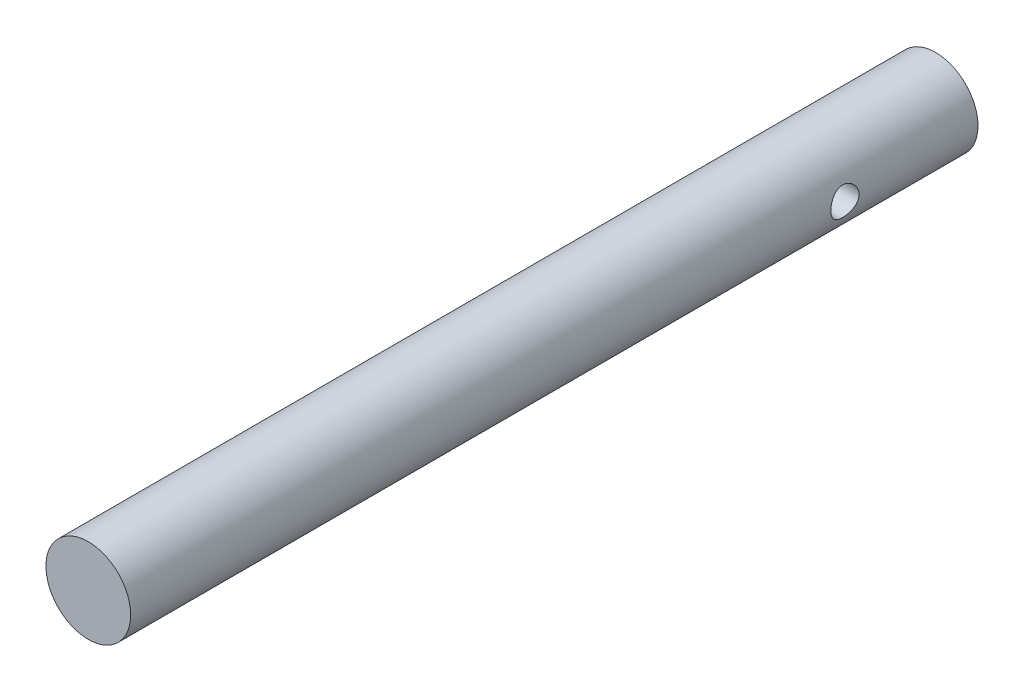
ISO-10303-21;
HEADER;
FILE_DESCRIPTION(('STEP AP214'),'2;1');
FILE_NAME('part.step','',(''),(''),'','','');
FILE_SCHEMA(('AUTOMOTIVE_DESIGN { 1 0 10303 214 1 1 1 1 }'));
ENDSEC;
DATA;
#1=APPLICATION_CONTEXT('core data for automotive mechanical design processes');
#2=APPLICATION_PROTOCOL_DEFINITION('international standard','automotive_design',2000,#1);
#3=PRODUCT_CONTEXT('',#1,'mechanical');
#4=PRODUCT('Part','Part','',(#3));
#5=PRODUCT_RELATED_PRODUCT_CATEGORY('part','',(#4));
#6=PRODUCT_DEFINITION_FORMATION('','',#4);
#7=PRODUCT_DEFINITION_CONTEXT('part definition',#1,'design');
#8=PRODUCT_DEFINITION('design','',#6,#7);
#9=PRODUCT_DEFINITION_SHAPE('','',#8);
#10=(LENGTH_UNIT() NAMED_UNIT(*) SI_UNIT(.MILLI.,.METRE.));
#11=(NAMED_UNIT(*) PLANE_ANGLE_UNIT() SI_UNIT($,.RADIAN.));
#12=(NAMED_UNIT(*) SI_UNIT($,.STERADIAN.) SOLID_ANGLE_UNIT());
#13=UNCERTAINTY_MEASURE_WITH_UNIT(LENGTH_MEASURE(1.E-05),#10,'distance_accuracy_value','');
#14=(GEOMETRIC_REPRESENTATION_CONTEXT(3) GLOBAL_UNCERTAINTY_ASSIGNED_CONTEXT((#13)) GLOBAL_UNIT_ASSIGNED_CONTEXT((#10,
#11,#12)) REPRESENTATION_CONTEXT('',''));
#15=CARTESIAN_POINT('',(0.,0.,0.));
#16=DIRECTION('',(0.,0.,1.));
#17=DIRECTION('',(1.,0.,0.));
#18=AXIS2_PLACEMENT_3D('',#15,#16,#17);
#19=CARTESIAN_POINT('',(0.,0.,60.));
#20=DIRECTION('',(0.,0.,-1.));
#21=DIRECTION('',(-1.,0.,0.));
#22=AXIS2_PLACEMENT_3D('',#19,#20,#21);
#23=CYLINDRICAL_SURFACE('',#22,3.);
#24=CARTESIAN_POINT('',(-3.,0.,8.42));
#25=CARTESIAN_POINT('',(-3.00000015300943,0.0545633628867235,8.41999974626836));
#26=CARTESIAN_POINT('',(-2.99849769507545,0.10912519453855,8.42448026612721));
#27=CARTESIAN_POINT('',(-2.99265210203281,0.216641760872973,8.44222910881722));
#28=CARTESIAN_POINT('',(-2.98830867202153,0.269596328118818,8.45549834394892));
#29=CARTESIAN_POINT('',(-2.97725307906443,0.372332789501776,8.49031924338405));
#30=CARTESIAN_POINT('',(-2.97054487730853,0.422119825886035,8.51185706245927));
#31=CARTESIAN_POINT('',(-2.95544445717342,0.517374936805325,8.56254117283834));
#32=CARTESIAN_POINT('',(-2.94705190667778,0.562842156958706,8.5916889650026));
#33=CARTESIAN_POINT('',(-2.92914094443005,0.649741675022267,8.65782580485875));
#34=CARTESIAN_POINT('',(-2.91959556463785,0.69100370029831,8.69503123426049));
#35=CARTESIAN_POINT('',(-2.90060314783122,0.766832692702085,8.77576715470656));
#36=CARTESIAN_POINT('',(-2.89115613290549,0.801398185489463,8.81929903492851));
#37=CARTESIAN_POINT('',(-2.87313332477274,0.86382494222786,8.91298511519646));
#38=CARTESIAN_POINT('',(-2.86459039275688,0.891464858221033,8.96329373973212));
#39=CARTESIAN_POINT('',(-2.84975305418601,0.937818873877723,9.06817609445855));
#40=CARTESIAN_POINT('',(-2.84345796160746,0.956535697386766,9.12274851716274));
#41=CARTESIAN_POINT('',(-2.83411303269377,0.983873461509165,9.23267322149671));
#42=CARTESIAN_POINT('',(-2.83096095769611,0.992813448271771,9.28793720848906));
#43=CARTESIAN_POINT('',(-2.82795656629508,1.00134112333448,9.39926375415588));
#44=CARTESIAN_POINT('',(-2.8281032302273,1.00093170160472,9.45532606070919));
#45=CARTESIAN_POINT('',(-2.8315901500818,0.99101990370342,9.56393663044402));
#46=CARTESIAN_POINT('',(-2.83478415867533,0.981933913166996,9.61652840291902));
#47=CARTESIAN_POINT('',(-2.84376657724551,0.955606162849418,9.71939341960683));
#48=CARTESIAN_POINT('',(-2.84955529784108,0.938363426591872,9.76966638543507));
#49=CARTESIAN_POINT('',(-2.86317911131249,0.895939058060212,9.86741274959148));
#50=CARTESIAN_POINT('',(-2.87104565793117,0.870634048707263,9.91482802546953));
#51=CARTESIAN_POINT('',(-2.88792558575726,0.81288910630314,10.0048709082797));
#52=CARTESIAN_POINT('',(-2.89693929790464,0.780447112364007,10.0474971269334));
#53=CARTESIAN_POINT('',(-2.91567329167741,0.707349332682239,10.1290915981608));
#54=CARTESIAN_POINT('',(-2.92540589354843,0.666353150076312,10.1677526945091));
#55=CARTESIAN_POINT('',(-2.94406938387037,0.578339569970065,10.2377312666634));
#56=CARTESIAN_POINT('',(-2.95300019538067,0.531321595660815,10.2690480381645));
#57=CARTESIAN_POINT('',(-2.96917107937794,0.431947613046268,10.3236963002351));
#58=CARTESIAN_POINT('',(-2.97639350008039,0.379543276416337,10.3469454913407));
#59=CARTESIAN_POINT('',(-2.98820567144435,0.271269083364508,10.3842031739557));
#60=CARTESIAN_POINT('',(-2.99279633654879,0.215400438154955,10.3982148754234));
#61=CARTESIAN_POINT('',(-2.99867627071441,0.104383829529304,10.4160556660224));
#62=CARTESIAN_POINT('',(-3.00010001833731,0.0493095998648456,10.4202998091727));
#63=CARTESIAN_POINT('',(-2.99988902694825,-0.0607750699602363,10.4196673264015));
#64=CARTESIAN_POINT('',(-2.99825480419352,-0.115785519319647,10.4147922400201));
#65=CARTESIAN_POINT('',(-2.99220024717114,-0.222519866304259,10.396388092264));
#66=CARTESIAN_POINT('',(-2.98786198711228,-0.274292806834856,10.3831137939505));
#67=CARTESIAN_POINT('',(-2.97691846830034,-0.374855958579561,10.3486065555333));
#68=CARTESIAN_POINT('',(-2.97031292046541,-0.42364578850856,10.3273726005323));
#69=CARTESIAN_POINT('',(-2.95528931287427,-0.518288296393322,10.2769295681591));
#70=CARTESIAN_POINT('',(-2.94682814756305,-0.56402995921733,10.2475254067164));
#71=CARTESIAN_POINT('',(-2.92905253915743,-0.650064830135404,10.1818058499869));
#72=CARTESIAN_POINT('',(-2.91973783591888,-0.690356367794894,10.1454883439698));
#73=CARTESIAN_POINT('',(-2.90076847982472,-0.766252507807014,10.0650212489917));
#74=CARTESIAN_POINT('',(-2.89111761095155,-0.801560969248492,10.0205907730668));
#75=CARTESIAN_POINT('',(-2.87299973286981,-0.864257522320854,9.9262284321955));
#76=CARTESIAN_POINT('',(-2.8645327335312,-0.891645547920844,9.8762965213898));
#77=CARTESIAN_POINT('',(-2.84982391820308,-0.937596930423361,9.77232698469341));
#78=CARTESIAN_POINT('',(-2.84357760900632,-0.956178132197767,9.71829792075722));
#79=CARTESIAN_POINT('',(-2.83410832399133,-0.983894666792164,9.60762134987585));
#80=CARTESIAN_POINT('',(-2.83088398622698,-0.993034254961245,9.55097503456694));
#81=CARTESIAN_POINT('',(-2.82797858875071,-1.00127628247038,9.43980290398679));
#82=CARTESIAN_POINT('',(-2.82812400344299,-1.00087025731093,9.38531765974826));
#83=CARTESIAN_POINT('',(-2.8315126992356,-0.99124229345488,9.27723492510026));
#84=CARTESIAN_POINT('',(-2.83475579595884,-0.982020879458888,9.22363738204709));
#85=CARTESIAN_POINT('',(-2.84384524278943,-0.955371813126982,9.11986433698733));
#86=CARTESIAN_POINT('',(-2.84964098015514,-0.938103346014881,9.06964317499277));
#87=CARTESIAN_POINT('',(-2.86316398825434,-0.895979365760384,8.97277259306447));
#88=CARTESIAN_POINT('',(-2.87089168765297,-0.871122168553981,8.92612396881274));
#89=CARTESIAN_POINT('',(-2.8878282922406,-0.813260692583251,8.83551633007631));
#90=CARTESIAN_POINT('',(-2.89708711641604,-0.779948242764534,8.7917634981014));
#91=CARTESIAN_POINT('',(-2.91583356283786,-0.706642883135699,8.71031018661601));
#92=CARTESIAN_POINT('',(-2.92532124912518,-0.666648084451496,8.67261142431198));
#93=CARTESIAN_POINT('',(-2.94390030525393,-0.579241556920676,8.60285558771076));
#94=CARTESIAN_POINT('',(-2.95296181801216,-0.531601513499727,8.57107565224898));
#95=CARTESIAN_POINT('',(-2.96925991172652,-0.43135735740663,8.51600957114937));
#96=CARTESIAN_POINT('',(-2.9764969590794,-0.378754518132351,8.49272125407796));
#97=CARTESIAN_POINT('',(-2.98805515068532,-0.272493647200976,8.45627836751132));
#98=CARTESIAN_POINT('',(-2.9924921242252,-0.218987757676409,8.44271753373662));
#99=CARTESIAN_POINT('',(-2.99846407064225,-0.110320416010248,8.42457971932287));
#100=CARTESIAN_POINT('',(-2.99999984531906,-0.0551594255687468,8.42000025650346));
#101=CARTESIAN_POINT('',(-3.,0.,8.42));
#102=B_SPLINE_CURVE_WITH_KNOTS('',3,(#24,#25,#26,#27,#28,#29,#30,#31,#32,#33,#34,#35,#36,#37,
#38,#39,#40,#41,#42,#43,#44,#45,#46,#47,#48,#49,#50,#51,#52,#53,#54,#55,#56,#57,#58,#59,#60,#61,
#62,#63,#64,#65,#66,#67,#68,#69,#70,#71,#72,#73,#74,#75,#76,#77,#78,#79,#80,#81,#82,#83,#84,#85,
#86,#87,#88,#89,#90,#91,#92,#93,#94,#95,#96,#97,#98,#99,#100,#101),.UNSPECIFIED.,.T.,.F.,(4,2,2,
2,2,2,2,2,2,2,2,2,2,2,2,2,2,2,2,2,2,2,2,2,2,2,2,2,2,2,2,2,2,2,2,2,2,2,4),(0.,0.163487106026011,
0.326991185267521,0.490222672870274,0.653486377799101,0.82184684282756,0.990244332875303,
1.16348384823471,1.33667044692833,1.5040192574184,1.67131633987486,1.83096826551281,
1.99063930855482,2.15288171155131,2.31517102558208,2.48593305811367,2.65671145966619,
2.82918405650358,3.00159668877209,3.1665358317517,3.33144713164177,3.49158157978214,
3.65173645284104,3.81610399843737,3.98052180821892,4.15241022880752,4.32430008234997,
4.49584013824417,4.66730284700846,4.82995666056619,4.99260079341186,5.15215587070228,
5.31174638165788,5.47830066681615,5.64490211113589,5.81799660824911,5.99104681142267,
6.15636558363624,6.32163866027951),.UNSPECIFIED.);
#103=CARTESIAN_POINT('',(-3.,0.,8.42));
#104=VERTEX_POINT('',#103);
#105=EDGE_CURVE('E10',#104,#104,#102,.T.);
#106=ORIENTED_EDGE('',*,*,#105,.T.);
#107=EDGE_LOOP('',(#106));
#108=FACE_BOUND('',#107,.T.);
#109=CARTESIAN_POINT('',(3.,0.,8.42));
#110=CARTESIAN_POINT('',(3.00000015300943,-0.0545633628867235,8.41999974626836));
#111=CARTESIAN_POINT('',(2.99849769507545,-0.10912519453855,8.42448026612721));
#112=CARTESIAN_POINT('',(2.99265210203281,-0.216641760872973,8.44222910881722));
#113=CARTESIAN_POINT('',(2.98830867202153,-0.269596328118818,8.45549834394892));
#114=CARTESIAN_POINT('',(2.97725307906443,-0.372332789501776,8.49031924338405));
#115=CARTESIAN_POINT('',(2.97054487730853,-0.422119825886035,8.51185706245927));
#116=CARTESIAN_POINT('',(2.95544445717342,-0.517374936805325,8.56254117283834));
#117=CARTESIAN_POINT('',(2.94705190667778,-0.562842156958706,8.5916889650026));
#118=CARTESIAN_POINT('',(2.92914094443005,-0.649741675022267,8.65782580485875));
#119=CARTESIAN_POINT('',(2.91959556463785,-0.69100370029831,8.69503123426049));
#120=CARTESIAN_POINT('',(2.90060314783122,-0.766832692702085,8.77576715470656));
#121=CARTESIAN_POINT('',(2.89115613290549,-0.801398185489464,8.81929903492851));
#122=CARTESIAN_POINT('',(2.87313332477274,-0.86382494222786,8.91298511519646));
#123=CARTESIAN_POINT('',(2.86459039275688,-0.891464858221033,8.96329373973212));
#124=CARTESIAN_POINT('',(2.84975305418601,-0.937818873877723,9.06817609445855));
#125=CARTESIAN_POINT('',(2.84345796160746,-0.956535697386767,9.12274851716274));
#126=CARTESIAN_POINT('',(2.83411303269377,-0.983873461509165,9.23267322149671));
#127=CARTESIAN_POINT('',(2.83096095769611,-0.992813448271771,9.28793720848907));
#128=CARTESIAN_POINT('',(2.82795656629508,-1.00134112333448,9.39926375415588));
#129=CARTESIAN_POINT('',(2.8281032302273,-1.00093170160472,9.45532606070919));
#130=CARTESIAN_POINT('',(2.8315901500818,-0.99101990370342,9.56393663044402));
#131=CARTESIAN_POINT('',(2.83478415867533,-0.981933913166996,9.61652840291902));
#132=CARTESIAN_POINT('',(2.84376657724551,-0.955606162849418,9.71939341960683));
#133=CARTESIAN_POINT('',(2.84955529784108,-0.938363426591872,9.76966638543507));
#134=CARTESIAN_POINT('',(2.86317911131249,-0.895939058060212,9.86741274959148));
#135=CARTESIAN_POINT('',(2.87104565793117,-0.870634048707263,9.91482802546953));
#136=CARTESIAN_POINT('',(2.88792558575726,-0.81288910630314,10.0048709082797));
#137=CARTESIAN_POINT('',(2.89693929790464,-0.780447112364007,10.0474971269334));
#138=CARTESIAN_POINT('',(2.91567329167741,-0.707349332682239,10.1290915981608));
#139=CARTESIAN_POINT('',(2.92540589354843,-0.666353150076313,10.1677526945091));
#140=CARTESIAN_POINT('',(2.94406938387037,-0.578339569970065,10.2377312666634));
#141=CARTESIAN_POINT('',(2.95300019538067,-0.531321595660816,10.2690480381645));
#142=CARTESIAN_POINT('',(2.96917107937794,-0.431947613046269,10.3236963002351));
#143=CARTESIAN_POINT('',(2.97639350008039,-0.379543276416338,10.3469454913407));
#144=CARTESIAN_POINT('',(2.98820567144435,-0.271269083364509,10.3842031739557));
#145=CARTESIAN_POINT('',(2.99279633654879,-0.215400438154955,10.3982148754234));
#146=CARTESIAN_POINT('',(2.99867627071441,-0.104383829529304,10.4160556660224));
#147=CARTESIAN_POINT('',(3.00010001833731,-0.0493095998648453,10.4202998091727));
#148=CARTESIAN_POINT('',(2.99988902694825,0.0607750699602365,10.4196673264015));
#149=CARTESIAN_POINT('',(2.99825480419352,0.115785519319647,10.4147922400201));
#150=CARTESIAN_POINT('',(2.99220024717114,0.22251986630426,10.396388092264));
#151=CARTESIAN_POINT('',(2.98786198711228,0.274292806834857,10.3831137939505));
#152=CARTESIAN_POINT('',(2.97691846830034,0.374855958579562,10.3486065555333));
#153=CARTESIAN_POINT('',(2.97031292046541,0.42364578850856,10.3273726005323));
#154=CARTESIAN_POINT('',(2.95528931287427,0.518288296393322,10.2769295681591));
#155=CARTESIAN_POINT('',(2.94682814756305,0.564029959217331,10.2475254067164));
#156=CARTESIAN_POINT('',(2.92905253915743,0.650064830135405,10.1818058499869));
#157=CARTESIAN_POINT('',(2.91973783591888,0.690356367794895,10.1454883439698));
#158=CARTESIAN_POINT('',(2.90076847982472,0.766252507807014,10.0650212489917));
#159=CARTESIAN_POINT('',(2.89111761095155,0.801560969248493,10.0205907730668));
#160=CARTESIAN_POINT('',(2.87299973286981,0.864257522320855,9.9262284321955));
#161=CARTESIAN_POINT('',(2.8645327335312,0.891645547920845,9.8762965213898));
#162=CARTESIAN_POINT('',(2.84982391820308,0.937596930423362,9.77232698469341));
#163=CARTESIAN_POINT('',(2.84357760900632,0.956178132197768,9.71829792075722));
#164=CARTESIAN_POINT('',(2.83410832399133,0.983894666792164,9.60762134987585));
#165=CARTESIAN_POINT('',(2.83088398622698,0.993034254961245,9.55097503456694));
#166=CARTESIAN_POINT('',(2.82797858875071,1.00127628247038,9.43980290398679));
#167=CARTESIAN_POINT('',(2.82812400344299,1.00087025731093,9.38531765974826));
#168=CARTESIAN_POINT('',(2.8315126992356,0.991242293454879,9.27723492510025));
#169=CARTESIAN_POINT('',(2.83475579595884,0.982020879458888,9.22363738204709));
#170=CARTESIAN_POINT('',(2.84384524278943,0.955371813126982,9.11986433698733));
#171=CARTESIAN_POINT('',(2.84964098015514,0.938103346014881,9.06964317499277));
#172=CARTESIAN_POINT('',(2.86316398825434,0.895979365760383,8.97277259306447));
#173=CARTESIAN_POINT('',(2.87089168765297,0.871122168553981,8.92612396881274));
#174=CARTESIAN_POINT('',(2.8878282922406,0.813260692583251,8.83551633007631));
#175=CARTESIAN_POINT('',(2.89708711641604,0.779948242764534,8.7917634981014));
#176=CARTESIAN_POINT('',(2.91583356283786,0.706642883135699,8.71031018661601));
#177=CARTESIAN_POINT('',(2.92532124912518,0.666648084451496,8.67261142431198));
#178=CARTESIAN_POINT('',(2.94390030525393,0.579241556920676,8.60285558771076));
#179=CARTESIAN_POINT('',(2.95296181801216,0.531601513499727,8.57107565224898));
#180=CARTESIAN_POINT('',(2.96925991172652,0.43135735740663,8.51600957114937));
#181=CARTESIAN_POINT('',(2.9764969590794,0.378754518132351,8.49272125407796));
#182=CARTESIAN_POINT('',(2.98805515068532,0.272493647200976,8.45627836751132));
#183=CARTESIAN_POINT('',(2.9924921242252,0.21898775767641,8.44271753373662));
#184=CARTESIAN_POINT('',(2.99846407064224,0.110320416010248,8.42457971932287));
#185=CARTESIAN_POINT('',(2.99999984531906,0.055159425568747,8.42000025650346));
#186=CARTESIAN_POINT('',(3.,0.,8.42));
#187=B_SPLINE_CURVE_WITH_KNOTS('',3,(#109,#110,#111,#112,#113,#114,#115,#116,#117,#118,#119,
#120,#121,#122,#123,#124,#125,#126,#127,#128,#129,#130,#131,#132,#133,#134,#135,#136,#137,#138,
#139,#140,#141,#142,#143,#144,#145,#146,#147,#148,#149,#150,#151,#152,#153,#154,#155,#156,#157,
#158,#159,#160,#161,#162,#163,#164,#165,#166,#167,#168,#169,#170,#171,#172,#173,#174,#175,#176,
#177,#178,#179,#180,#181,#182,#183,#184,#185,#186),.UNSPECIFIED.,.T.,.F.,(4,2,2,2,2,2,2,2,2,2,2,
2,2,2,2,2,2,2,2,2,2,2,2,2,2,2,2,2,2,2,2,2,2,2,2,2,2,2,4),(0.,0.163487106026011,
0.326991185267521,0.490222672870274,0.653486377799101,0.821846842827561,0.990244332875305,
1.16348384823471,1.33667044692834,1.5040192574184,1.67131633987486,1.83096826551281,
1.99063930855482,2.15288171155131,2.31517102558208,2.48593305811367,2.65671145966619,
2.82918405650358,3.00159668877209,3.1665358317517,3.33144713164177,3.49158157978214,
3.65173645284104,3.81610399843737,3.98052180821892,4.15241022880752,4.32430008234997,
4.49584013824417,4.66730284700846,4.82995666056619,4.99260079341186,5.15215587070228,
5.31174638165788,5.47830066681615,5.64490211113589,5.81799660824911,5.99104681142267,
6.15636558363624,6.32163866027951),.UNSPECIFIED.);
#188=CARTESIAN_POINT('',(3.,0.,8.42));
#189=VERTEX_POINT('',#188);
#190=EDGE_CURVE('E48',#189,#189,#187,.T.);
#191=ORIENTED_EDGE('',*,*,#190,.T.);
#192=EDGE_LOOP('',(#191));
#193=FACE_BOUND('',#192,.T.);
#194=CARTESIAN_POINT('',(0.,0.,60.));
#195=DIRECTION('',(0.,0.,1.));
#196=DIRECTION('',(1.,0.,0.));
#197=AXIS2_PLACEMENT_3D('',#194,#195,#196);
#198=CIRCLE('',#197,3.);
#199=CARTESIAN_POINT('',(3.,0.,60.));
#200=VERTEX_POINT('',#199);
#201=EDGE_CURVE('E53',#200,#200,#198,.T.);
#202=ORIENTED_EDGE('',*,*,#201,.F.);
#203=EDGE_LOOP('',(#202));
#204=FACE_BOUND('',#203,.T.);
#205=CARTESIAN_POINT('',(0.,0.,0.));
#206=DIRECTION('',(0.,0.,1.));
#207=DIRECTION('',(1.,0.,0.));
#208=AXIS2_PLACEMENT_3D('',#205,#206,#207);
#209=CIRCLE('',#208,3.);
#210=CARTESIAN_POINT('',(3.,0.,0.));
#211=VERTEX_POINT('',#210);
#212=EDGE_CURVE('E58',#211,#211,#209,.T.);
#213=ORIENTED_EDGE('',*,*,#212,.T.);
#214=EDGE_LOOP('',(#213));
#215=FACE_BOUND('',#214,.T.);
#216=ADVANCED_FACE('F36',(#108,#193,#204,#215),#23,.T.);
#217=CARTESIAN_POINT('',(0.,0.,60.));
#218=DIRECTION('',(0.,0.,1.));
#219=DIRECTION('',(1.,0.,0.));
#220=AXIS2_PLACEMENT_3D('',#217,#218,#219);
#221=PLANE('',#220);
#222=ORIENTED_EDGE('',*,*,#201,.T.);
#223=EDGE_LOOP('',(#222));
#224=FACE_BOUND('',#223,.T.);
#225=ADVANCED_FACE('F70',(#224),#221,.T.);
#226=CARTESIAN_POINT('',(0.,0.,0.));
#227=DIRECTION('',(0.,0.,1.));
#228=DIRECTION('',(1.,0.,0.));
#229=AXIS2_PLACEMENT_3D('',#226,#227,#228);
#230=PLANE('',#229);
#231=ORIENTED_EDGE('',*,*,#212,.F.);
#232=EDGE_LOOP('',(#231));
#233=FACE_BOUND('',#232,.T.);
#234=ADVANCED_FACE('F68',(#233),#230,.F.);
#235=CARTESIAN_POINT('',(-3.,0.,9.42));
#236=DIRECTION('',(1.,0.,0.));
#237=DIRECTION('',(0.,0.,-1.));
#238=AXIS2_PLACEMENT_3D('',#235,#236,#237);
#239=CYLINDRICAL_SURFACE('',#238,1.);
#240=ORIENTED_EDGE('',*,*,#190,.F.);
#241=EDGE_LOOP('',(#240));
#242=FACE_BOUND('',#241,.T.);
#243=ORIENTED_EDGE('',*,*,#105,.F.);
#244=EDGE_LOOP('',(#243));
#245=FACE_BOUND('',#244,.T.);
#246=ADVANCED_FACE('F64',(#242,#245),#239,.F.);
#247=CLOSED_SHELL('',(#216,#225,#234,#246));
#248=MANIFOLD_SOLID_BREP('B2',#247);
#249=ADVANCED_BREP_SHAPE_REPRESENTATION('',(#18,#248),#14);
#250=SHAPE_DEFINITION_REPRESENTATION(#9,#249);
ENDSEC;
END-ISO-10303-21;
